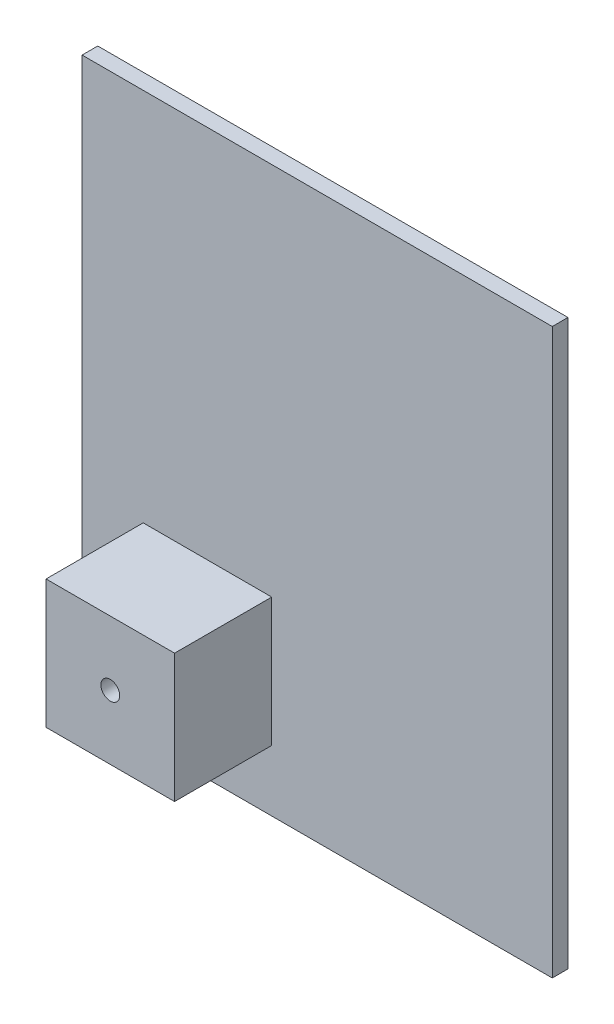
ISO-10303-21;
HEADER;
FILE_DESCRIPTION(('STEP AP214'),'2;1');
FILE_NAME('part.step','',(''),(''),'','','');
FILE_SCHEMA(('AUTOMOTIVE_DESIGN { 1 0 10303 214 1 1 1 1 }'));
ENDSEC;
DATA;
#1=APPLICATION_CONTEXT('core data for automotive mechanical design processes');
#2=APPLICATION_PROTOCOL_DEFINITION('international standard','automotive_design',2000,#1);
#3=PRODUCT_CONTEXT('',#1,'mechanical');
#4=PRODUCT('Part','Part','',(#3));
#5=PRODUCT_RELATED_PRODUCT_CATEGORY('part','',(#4));
#6=PRODUCT_DEFINITION_FORMATION('','',#4);
#7=PRODUCT_DEFINITION_CONTEXT('part definition',#1,'design');
#8=PRODUCT_DEFINITION('design','',#6,#7);
#9=PRODUCT_DEFINITION_SHAPE('','',#8);
#10=(LENGTH_UNIT() NAMED_UNIT(*) SI_UNIT(.MILLI.,.METRE.));
#11=(NAMED_UNIT(*) PLANE_ANGLE_UNIT() SI_UNIT($,.RADIAN.));
#12=(NAMED_UNIT(*) SI_UNIT($,.STERADIAN.) SOLID_ANGLE_UNIT());
#13=UNCERTAINTY_MEASURE_WITH_UNIT(LENGTH_MEASURE(1.E-05),#10,'distance_accuracy_value','');
#14=(GEOMETRIC_REPRESENTATION_CONTEXT(3) GLOBAL_UNCERTAINTY_ASSIGNED_CONTEXT((#13)) GLOBAL_UNIT_ASSIGNED_CONTEXT((#10,
#11,#12)) REPRESENTATION_CONTEXT('',''));
#15=CARTESIAN_POINT('',(0.,0.,0.));
#16=DIRECTION('',(0.,0.,1.));
#17=DIRECTION('',(1.,0.,0.));
#18=AXIS2_PLACEMENT_3D('',#15,#16,#17);
#19=CARTESIAN_POINT('',(-35.,-50.,-20.));
#20=DIRECTION('',(0.,0.,1.));
#21=DIRECTION('',(1.,0.,0.));
#22=AXIS2_PLACEMENT_3D('',#19,#20,#21);
#23=CYLINDRICAL_SURFACE('',#22,3.);
#24=CARTESIAN_POINT('',(-35.,-50.,-20.));
#25=DIRECTION('',(0.,0.,1.));
#26=DIRECTION('',(1.,0.,0.));
#27=AXIS2_PLACEMENT_3D('',#24,#25,#26);
#28=CIRCLE('',#27,3.);
#29=CARTESIAN_POINT('',(-32.,-50.,-20.));
#30=VERTEX_POINT('',#29);
#31=EDGE_CURVE('E11',#30,#30,#28,.T.);
#32=ORIENTED_EDGE('',*,*,#31,.T.);
#33=EDGE_LOOP('',(#32));
#34=FACE_BOUND('',#33,.T.);
#35=CARTESIAN_POINT('',(-35.,-50.,0.));
#36=DIRECTION('',(0.,0.,1.));
#37=DIRECTION('',(1.,0.,0.));
#38=AXIS2_PLACEMENT_3D('',#35,#36,#37);
#39=CIRCLE('',#38,3.);
#40=CARTESIAN_POINT('',(-32.,-50.,0.));
#41=VERTEX_POINT('',#40);
#42=EDGE_CURVE('E46',#41,#41,#39,.T.);
#43=ORIENTED_EDGE('',*,*,#42,.F.);
#44=EDGE_LOOP('',(#43));
#45=FACE_BOUND('',#44,.T.);
#46=ADVANCED_FACE('F43',(#34,#45),#23,.T.);
#47=CARTESIAN_POINT('',(0.,0.,-20.));
#48=DIRECTION('',(0.,0.,1.));
#49=DIRECTION('',(1.,0.,0.));
#50=AXIS2_PLACEMENT_3D('',#47,#48,#49);
#51=PLANE('',#50);
#52=ORIENTED_EDGE('',*,*,#31,.F.);
#53=EDGE_LOOP('',(#52));
#54=FACE_BOUND('',#53,.T.);
#55=ADVANCED_FACE('F58',(#54),#51,.F.);
#56=CARTESIAN_POINT('',(0.,0.,0.));
#57=DIRECTION('',(0.,0.,1.));
#58=DIRECTION('',(1.,0.,0.));
#59=AXIS2_PLACEMENT_3D('',#56,#57,#58);
#60=PLANE('',#59);
#61=ORIENTED_EDGE('',*,*,#42,.T.);
#62=EDGE_LOOP('',(#61));
#63=FACE_BOUND('',#62,.T.);
#64=ADVANCED_FACE('F55',(#63),#60,.T.);
#65=CLOSED_SHELL('',(#46,#55,#64));
#66=MANIFOLD_SOLID_BREP('B2',#65);
#67=CARTESIAN_POINT('',(-75.,0.,5.));
#68=DIRECTION('',(-1.,0.,0.));
#69=DIRECTION('',(0.,0.,1.));
#70=AXIS2_PLACEMENT_3D('',#67,#68,#69);
#71=PLANE('',#70);
#72=DIRECTION('',(0.,1.,0.));
#73=VECTOR('',#72,1.);
#74=CARTESIAN_POINT('',(-75.,0.,0.));
#75=LINE('',#74,#73);
#76=CARTESIAN_POINT('',(-75.,-90.,0.));
#77=VERTEX_POINT('',#76);
#78=CARTESIAN_POINT('',(-75.,90.,0.));
#79=VERTEX_POINT('',#78);
#80=EDGE_CURVE('E168',#77,#79,#75,.T.);
#81=ORIENTED_EDGE('',*,*,#80,.F.);
#82=DIRECTION('',(0.,0.,-1.));
#83=VECTOR('',#82,1.);
#84=CARTESIAN_POINT('',(-75.,-90.,5.));
#85=LINE('',#84,#83);
#86=CARTESIAN_POINT('',(-75.,-90.,5.));
#87=VERTEX_POINT('',#86);
#88=EDGE_CURVE('E41',#87,#77,#85,.T.);
#89=ORIENTED_EDGE('',*,*,#88,.F.);
#90=DIRECTION('',(0.,1.,0.));
#91=VECTOR('',#90,1.);
#92=CARTESIAN_POINT('',(-75.,0.,5.));
#93=LINE('',#92,#91);
#94=CARTESIAN_POINT('',(-75.,90.,5.));
#95=VERTEX_POINT('',#94);
#96=EDGE_CURVE('E178',#87,#95,#93,.T.);
#97=ORIENTED_EDGE('',*,*,#96,.T.);
#98=DIRECTION('',(0.,0.,-1.));
#99=VECTOR('',#98,1.);
#100=CARTESIAN_POINT('',(-75.,90.,5.));
#101=LINE('',#100,#99);
#102=EDGE_CURVE('E124',#95,#79,#101,.T.);
#103=ORIENTED_EDGE('',*,*,#102,.T.);
#104=EDGE_LOOP('',(#81,#89,#97,#103));
#105=FACE_BOUND('',#104,.T.);
#106=ADVANCED_FACE('F84',(#105),#71,.T.);
#107=CARTESIAN_POINT('',(0.,-90.,5.));
#108=DIRECTION('',(0.,-1.,0.));
#109=DIRECTION('',(1.,0.,0.));
#110=AXIS2_PLACEMENT_3D('',#107,#108,#109);
#111=PLANE('',#110);
#112=DIRECTION('',(-1.,0.,0.));
#113=VECTOR('',#112,1.);
#114=CARTESIAN_POINT('',(0.,-90.,0.));
#115=LINE('',#114,#113);
#116=CARTESIAN_POINT('',(75.,-90.,0.));
#117=VERTEX_POINT('',#116);
#118=EDGE_CURVE('E172',#117,#77,#115,.T.);
#119=ORIENTED_EDGE('',*,*,#118,.F.);
#120=DIRECTION('',(0.,0.,-1.));
#121=VECTOR('',#120,1.);
#122=CARTESIAN_POINT('',(75.,-90.,5.));
#123=LINE('',#122,#121);
#124=CARTESIAN_POINT('',(75.,-90.,5.));
#125=VERTEX_POINT('',#124);
#126=EDGE_CURVE('E92',#125,#117,#123,.T.);
#127=ORIENTED_EDGE('',*,*,#126,.F.);
#128=DIRECTION('',(-1.,0.,0.));
#129=VECTOR('',#128,1.);
#130=CARTESIAN_POINT('',(0.,-90.,5.));
#131=LINE('',#130,#129);
#132=EDGE_CURVE('E180',#125,#87,#131,.T.);
#133=ORIENTED_EDGE('',*,*,#132,.T.);
#134=ORIENTED_EDGE('',*,*,#88,.T.);
#135=EDGE_LOOP('',(#119,#127,#133,#134));
#136=FACE_BOUND('',#135,.T.);
#137=ADVANCED_FACE('F204',(#136),#111,.T.);
#138=CARTESIAN_POINT('',(75.,0.,5.));
#139=DIRECTION('',(-1.,0.,0.));
#140=DIRECTION('',(0.,0.,1.));
#141=AXIS2_PLACEMENT_3D('',#138,#139,#140);
#142=PLANE('',#141);
#143=DIRECTION('',(0.,1.,0.));
#144=VECTOR('',#143,1.);
#145=CARTESIAN_POINT('',(75.,0.,0.));
#146=LINE('',#145,#144);
#147=CARTESIAN_POINT('',(75.,90.,0.));
#148=VERTEX_POINT('',#147);
#149=EDGE_CURVE('E116',#117,#148,#146,.T.);
#150=ORIENTED_EDGE('',*,*,#149,.T.);
#151=DIRECTION('',(0.,0.,-1.));
#152=VECTOR('',#151,1.);
#153=CARTESIAN_POINT('',(75.,90.,5.));
#154=LINE('',#153,#152);
#155=CARTESIAN_POINT('',(75.,90.,5.));
#156=VERTEX_POINT('',#155);
#157=EDGE_CURVE('E194',#156,#148,#154,.T.);
#158=ORIENTED_EDGE('',*,*,#157,.F.);
#159=DIRECTION('',(0.,1.,0.));
#160=VECTOR('',#159,1.);
#161=CARTESIAN_POINT('',(75.,0.,5.));
#162=LINE('',#161,#160);
#163=EDGE_CURVE('E184',#125,#156,#162,.T.);
#164=ORIENTED_EDGE('',*,*,#163,.F.);
#165=ORIENTED_EDGE('',*,*,#126,.T.);
#166=EDGE_LOOP('',(#150,#158,#164,#165));
#167=FACE_BOUND('',#166,.T.);
#168=ADVANCED_FACE('F196',(#167),#142,.F.);
#169=CARTESIAN_POINT('',(0.,90.,5.));
#170=DIRECTION('',(0.,-1.,0.));
#171=DIRECTION('',(1.,0.,0.));
#172=AXIS2_PLACEMENT_3D('',#169,#170,#171);
#173=PLANE('',#172);
#174=DIRECTION('',(-1.,0.,0.));
#175=VECTOR('',#174,1.);
#176=CARTESIAN_POINT('',(0.,90.,0.));
#177=LINE('',#176,#175);
#178=EDGE_CURVE('E181',#148,#79,#177,.T.);
#179=ORIENTED_EDGE('',*,*,#178,.T.);
#180=ORIENTED_EDGE('',*,*,#102,.F.);
#181=DIRECTION('',(-1.,0.,0.));
#182=VECTOR('',#181,1.);
#183=CARTESIAN_POINT('',(0.,90.,5.));
#184=LINE('',#183,#182);
#185=EDGE_CURVE('E150',#156,#95,#184,.T.);
#186=ORIENTED_EDGE('',*,*,#185,.F.);
#187=ORIENTED_EDGE('',*,*,#157,.T.);
#188=EDGE_LOOP('',(#179,#180,#186,#187));
#189=FACE_BOUND('',#188,.T.);
#190=ADVANCED_FACE('F212',(#189),#173,.F.);
#191=CARTESIAN_POINT('',(0.,0.,5.));
#192=DIRECTION('',(0.,0.,1.));
#193=DIRECTION('',(1.,0.,0.));
#194=AXIS2_PLACEMENT_3D('',#191,#192,#193);
#195=PLANE('',#194);
#196=ORIENTED_EDGE('',*,*,#96,.F.);
#197=ORIENTED_EDGE('',*,*,#132,.F.);
#198=ORIENTED_EDGE('',*,*,#163,.T.);
#199=ORIENTED_EDGE('',*,*,#185,.T.);
#200=EDGE_LOOP('',(#196,#197,#198,#199));
#201=FACE_BOUND('',#200,.T.);
#202=DIRECTION('',(-1.,0.,0.));
#203=VECTOR('',#202,1.);
#204=CARTESIAN_POINT('',(0.,-70.5,5.));
#205=LINE('',#204,#203);
#206=CARTESIAN_POINT('',(-14.5,-70.5,5.));
#207=VERTEX_POINT('',#206);
#208=CARTESIAN_POINT('',(-55.5,-70.5,5.));
#209=VERTEX_POINT('',#208);
#210=EDGE_CURVE('E141',#207,#209,#205,.T.);
#211=ORIENTED_EDGE('',*,*,#210,.T.);
#212=DIRECTION('',(0.,1.,0.));
#213=VECTOR('',#212,1.);
#214=CARTESIAN_POINT('',(-55.5,0.,5.));
#215=LINE('',#214,#213);
#216=CARTESIAN_POINT('',(-55.5,-29.5,5.));
#217=VERTEX_POINT('',#216);
#218=EDGE_CURVE('E144',#209,#217,#215,.T.);
#219=ORIENTED_EDGE('',*,*,#218,.T.);
#220=DIRECTION('',(-1.,0.,0.));
#221=VECTOR('',#220,1.);
#222=CARTESIAN_POINT('',(0.,-29.5,5.));
#223=LINE('',#222,#221);
#224=CARTESIAN_POINT('',(-14.5,-29.5,5.));
#225=VERTEX_POINT('',#224);
#226=EDGE_CURVE('E162',#225,#217,#223,.T.);
#227=ORIENTED_EDGE('',*,*,#226,.F.);
#228=DIRECTION('',(0.,1.,0.));
#229=VECTOR('',#228,1.);
#230=CARTESIAN_POINT('',(-14.5,0.,5.));
#231=LINE('',#230,#229);
#232=EDGE_CURVE('E100',#207,#225,#231,.T.);
#233=ORIENTED_EDGE('',*,*,#232,.F.);
#234=EDGE_LOOP('',(#211,#219,#227,#233));
#235=FACE_BOUND('',#234,.T.);
#236=ADVANCED_FACE('F143',(#201,#235),#195,.T.);
#237=CARTESIAN_POINT('',(0.,0.,0.));
#238=DIRECTION('',(0.,0.,1.));
#239=DIRECTION('',(1.,0.,0.));
#240=AXIS2_PLACEMENT_3D('',#237,#238,#239);
#241=PLANE('',#240);
#242=ORIENTED_EDGE('',*,*,#80,.T.);
#243=ORIENTED_EDGE('',*,*,#178,.F.);
#244=ORIENTED_EDGE('',*,*,#149,.F.);
#245=ORIENTED_EDGE('',*,*,#118,.T.);
#246=EDGE_LOOP('',(#242,#243,#244,#245));
#247=FACE_BOUND('',#246,.T.);
#248=CARTESIAN_POINT('',(-35.,-50.,0.));
#249=DIRECTION('',(0.,0.,1.));
#250=DIRECTION('',(1.,0.,0.));
#251=AXIS2_PLACEMENT_3D('',#248,#249,#250);
#252=CIRCLE('',#251,3.);
#253=CARTESIAN_POINT('',(-32.,-50.,0.));
#254=VERTEX_POINT('',#253);
#255=EDGE_CURVE('E259',#254,#254,#252,.T.);
#256=ORIENTED_EDGE('',*,*,#255,.T.);
#257=EDGE_LOOP('',(#256));
#258=FACE_BOUND('',#257,.T.);
#259=ADVANCED_FACE('F202',(#247,#258),#241,.F.);
#260=CARTESIAN_POINT('',(-55.5,0.,36.));
#261=DIRECTION('',(-1.,0.,0.));
#262=DIRECTION('',(0.,0.,1.));
#263=AXIS2_PLACEMENT_3D('',#260,#261,#262);
#264=PLANE('',#263);
#265=DIRECTION('',(0.,0.,-1.));
#266=VECTOR('',#265,1.);
#267=CARTESIAN_POINT('',(-55.5,-29.5,36.));
#268=LINE('',#267,#266);
#269=CARTESIAN_POINT('',(-55.5,-29.5,36.));
#270=VERTEX_POINT('',#269);
#271=EDGE_CURVE('E161',#270,#217,#268,.T.);
#272=ORIENTED_EDGE('',*,*,#271,.T.);
#273=ORIENTED_EDGE('',*,*,#218,.F.);
#274=DIRECTION('',(0.,0.,-1.));
#275=VECTOR('',#274,1.);
#276=CARTESIAN_POINT('',(-55.5,-70.5,36.));
#277=LINE('',#276,#275);
#278=CARTESIAN_POINT('',(-55.5,-70.5,36.));
#279=VERTEX_POINT('',#278);
#280=EDGE_CURVE('E158',#279,#209,#277,.T.);
#281=ORIENTED_EDGE('',*,*,#280,.F.);
#282=DIRECTION('',(0.,1.,0.));
#283=VECTOR('',#282,1.);
#284=CARTESIAN_POINT('',(-55.5,0.,36.));
#285=LINE('',#284,#283);
#286=EDGE_CURVE('E249',#279,#270,#285,.T.);
#287=ORIENTED_EDGE('',*,*,#286,.T.);
#288=EDGE_LOOP('',(#272,#273,#281,#287));
#289=FACE_BOUND('',#288,.T.);
#290=ADVANCED_FACE('F155',(#289),#264,.T.);
#291=CARTESIAN_POINT('',(0.,-70.5,36.));
#292=DIRECTION('',(0.,-1.,0.));
#293=DIRECTION('',(0.,0.,-1.));
#294=AXIS2_PLACEMENT_3D('',#291,#292,#293);
#295=PLANE('',#294);
#296=ORIENTED_EDGE('',*,*,#280,.T.);
#297=ORIENTED_EDGE('',*,*,#210,.F.);
#298=DIRECTION('',(0.,0.,-1.));
#299=VECTOR('',#298,1.);
#300=CARTESIAN_POINT('',(-14.5,-70.5,36.));
#301=LINE('',#300,#299);
#302=CARTESIAN_POINT('',(-14.5,-70.5,36.));
#303=VERTEX_POINT('',#302);
#304=EDGE_CURVE('E169',#303,#207,#301,.T.);
#305=ORIENTED_EDGE('',*,*,#304,.F.);
#306=DIRECTION('',(-1.,0.,0.));
#307=VECTOR('',#306,1.);
#308=CARTESIAN_POINT('',(0.,-70.5,36.));
#309=LINE('',#308,#307);
#310=EDGE_CURVE('E167',#303,#279,#309,.T.);
#311=ORIENTED_EDGE('',*,*,#310,.T.);
#312=EDGE_LOOP('',(#296,#297,#305,#311));
#313=FACE_BOUND('',#312,.T.);
#314=ADVANCED_FACE('F165',(#313),#295,.T.);
#315=CARTESIAN_POINT('',(-14.5,0.,36.));
#316=DIRECTION('',(-1.,0.,0.));
#317=DIRECTION('',(0.,0.,1.));
#318=AXIS2_PLACEMENT_3D('',#315,#316,#317);
#319=PLANE('',#318);
#320=ORIENTED_EDGE('',*,*,#232,.T.);
#321=DIRECTION('',(0.,0.,-1.));
#322=VECTOR('',#321,1.);
#323=CARTESIAN_POINT('',(-14.5,-29.5,36.));
#324=LINE('',#323,#322);
#325=CARTESIAN_POINT('',(-14.5,-29.5,36.));
#326=VERTEX_POINT('',#325);
#327=EDGE_CURVE('E174',#326,#225,#324,.T.);
#328=ORIENTED_EDGE('',*,*,#327,.F.);
#329=DIRECTION('',(0.,1.,0.));
#330=VECTOR('',#329,1.);
#331=CARTESIAN_POINT('',(-14.5,0.,36.));
#332=LINE('',#331,#330);
#333=EDGE_CURVE('E257',#303,#326,#332,.T.);
#334=ORIENTED_EDGE('',*,*,#333,.F.);
#335=ORIENTED_EDGE('',*,*,#304,.T.);
#336=EDGE_LOOP('',(#320,#328,#334,#335));
#337=FACE_BOUND('',#336,.T.);
#338=ADVANCED_FACE('F227',(#337),#319,.F.);
#339=CARTESIAN_POINT('',(-35.,-50.,36.));
#340=DIRECTION('',(0.,0.,-1.));
#341=DIRECTION('',(-1.,0.,0.));
#342=AXIS2_PLACEMENT_3D('',#339,#340,#341);
#343=CYLINDRICAL_SURFACE('',#342,3.);
#344=CARTESIAN_POINT('',(-35.,-50.,36.));
#345=DIRECTION('',(0.,0.,1.));
#346=DIRECTION('',(1.,0.,0.));
#347=AXIS2_PLACEMENT_3D('',#344,#345,#346);
#348=CIRCLE('',#347,3.);
#349=CARTESIAN_POINT('',(-32.,-50.,36.));
#350=VERTEX_POINT('',#349);
#351=EDGE_CURVE('E247',#350,#350,#348,.T.);
#352=ORIENTED_EDGE('',*,*,#351,.T.);
#353=EDGE_LOOP('',(#352));
#354=FACE_BOUND('',#353,.T.);
#355=ORIENTED_EDGE('',*,*,#255,.F.);
#356=EDGE_LOOP('',(#355));
#357=FACE_BOUND('',#356,.T.);
#358=ADVANCED_FACE('F223',(#354,#357),#343,.F.);
#359=CARTESIAN_POINT('',(0.,-29.5,36.));
#360=DIRECTION('',(0.,-1.,0.));
#361=DIRECTION('',(1.,0.,0.));
#362=AXIS2_PLACEMENT_3D('',#359,#360,#361);
#363=PLANE('',#362);
#364=ORIENTED_EDGE('',*,*,#226,.T.);
#365=ORIENTED_EDGE('',*,*,#271,.F.);
#366=DIRECTION('',(-1.,0.,0.));
#367=VECTOR('',#366,1.);
#368=CARTESIAN_POINT('',(0.,-29.5,36.));
#369=LINE('',#368,#367);
#370=EDGE_CURVE('E254',#326,#270,#369,.T.);
#371=ORIENTED_EDGE('',*,*,#370,.F.);
#372=ORIENTED_EDGE('',*,*,#327,.T.);
#373=EDGE_LOOP('',(#364,#365,#371,#372));
#374=FACE_BOUND('',#373,.T.);
#375=ADVANCED_FACE('F226',(#374),#363,.F.);
#376=CARTESIAN_POINT('',(0.,0.,36.));
#377=DIRECTION('',(0.,0.,1.));
#378=DIRECTION('',(1.,0.,0.));
#379=AXIS2_PLACEMENT_3D('',#376,#377,#378);
#380=PLANE('',#379);
#381=ORIENTED_EDGE('',*,*,#351,.F.);
#382=EDGE_LOOP('',(#381));
#383=FACE_BOUND('',#382,.T.);
#384=ORIENTED_EDGE('',*,*,#286,.F.);
#385=ORIENTED_EDGE('',*,*,#310,.F.);
#386=ORIENTED_EDGE('',*,*,#333,.T.);
#387=ORIENTED_EDGE('',*,*,#370,.T.);
#388=EDGE_LOOP('',(#384,#385,#386,#387));
#389=FACE_BOUND('',#388,.T.);
#390=ADVANCED_FACE('F238',(#383,#389),#380,.T.);
#391=CLOSED_SHELL('',(#106,#137,#168,#190,#236,#259,#290,#314,#338,#358,#375,#390));
#392=MANIFOLD_SOLID_BREP('B6',#391);
#393=ADVANCED_BREP_SHAPE_REPRESENTATION('',(#18,#66,#392),#14);
#394=SHAPE_DEFINITION_REPRESENTATION(#9,#393);
ENDSEC;
END-ISO-10303-21;
